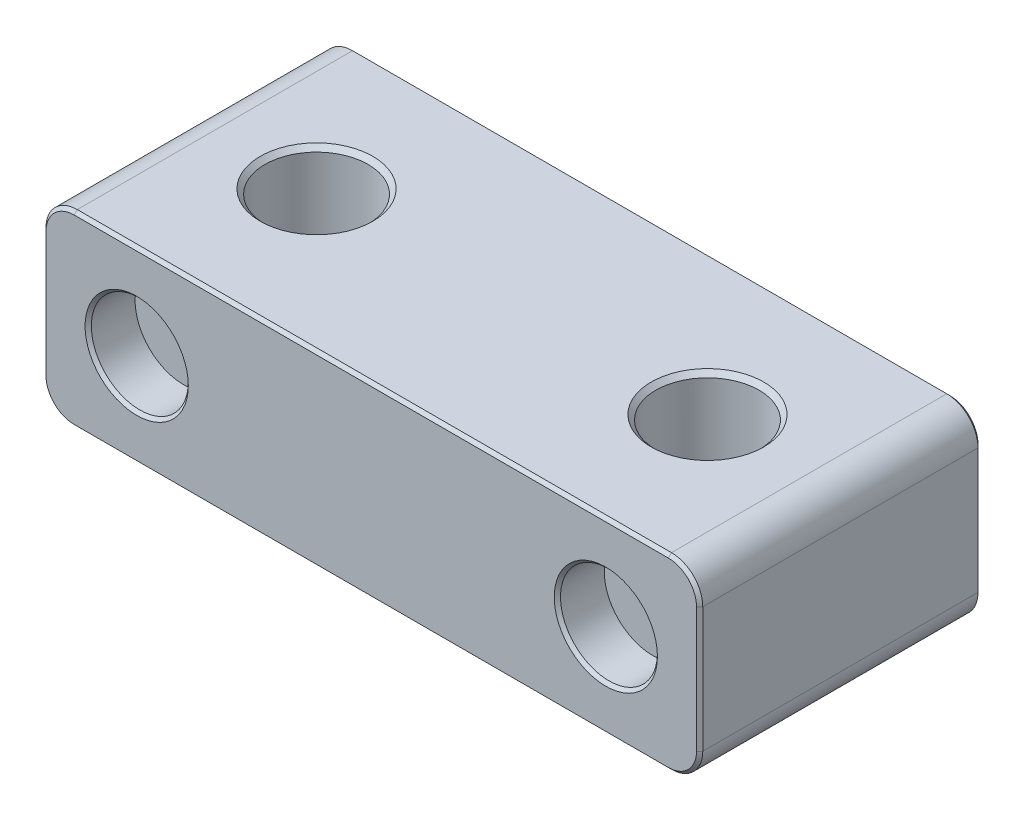
ISO-10303-21;
HEADER;
FILE_DESCRIPTION(('STEP AP214'),'2;1');
FILE_NAME('part.step','',(''),(''),'','','');
FILE_SCHEMA(('AUTOMOTIVE_DESIGN { 1 0 10303 214 1 1 1 1 }'));
ENDSEC;
DATA;
#1=APPLICATION_CONTEXT('core data for automotive mechanical design processes');
#2=APPLICATION_PROTOCOL_DEFINITION('international standard','automotive_design',2000,#1);
#3=PRODUCT_CONTEXT('',#1,'mechanical');
#4=PRODUCT('Part','Part','',(#3));
#5=PRODUCT_RELATED_PRODUCT_CATEGORY('part','',(#4));
#6=PRODUCT_DEFINITION_FORMATION('','',#4);
#7=PRODUCT_DEFINITION_CONTEXT('part definition',#1,'design');
#8=PRODUCT_DEFINITION('design','',#6,#7);
#9=PRODUCT_DEFINITION_SHAPE('','',#8);
#10=(LENGTH_UNIT() NAMED_UNIT(*) SI_UNIT(.MILLI.,.METRE.));
#11=(NAMED_UNIT(*) PLANE_ANGLE_UNIT() SI_UNIT($,.RADIAN.));
#12=(NAMED_UNIT(*) SI_UNIT($,.STERADIAN.) SOLID_ANGLE_UNIT());
#13=UNCERTAINTY_MEASURE_WITH_UNIT(LENGTH_MEASURE(1.E-05),#10,'distance_accuracy_value','');
#14=(GEOMETRIC_REPRESENTATION_CONTEXT(3) GLOBAL_UNCERTAINTY_ASSIGNED_CONTEXT((#13)) GLOBAL_UNIT_ASSIGNED_CONTEXT((#10,
#11,#12)) REPRESENTATION_CONTEXT('',''));
#15=CARTESIAN_POINT('',(0.,0.,0.));
#16=DIRECTION('',(0.,0.,1.));
#17=DIRECTION('',(1.,0.,0.));
#18=AXIS2_PLACEMENT_3D('',#15,#16,#17);
#19=CARTESIAN_POINT('',(0.,0.,9.));
#20=DIRECTION('',(0.,0.,1.));
#21=DIRECTION('',(1.,0.,0.));
#22=AXIS2_PLACEMENT_3D('',#19,#20,#21);
#23=PLANE('',#22);
#24=CARTESIAN_POINT('',(15.,0.,9.));
#25=DIRECTION('',(0.,0.,1.));
#26=DIRECTION('',(1.,0.,0.));
#27=AXIS2_PLACEMENT_3D('',#24,#25,#26);
#28=CIRCLE('',#27,3.3);
#29=CARTESIAN_POINT('',(18.3,0.,9.));
#30=VERTEX_POINT('',#29);
#31=EDGE_CURVE('E215',#30,#30,#28,.F.);
#32=ORIENTED_EDGE('',*,*,#31,.T.);
#33=EDGE_LOOP('',(#32));
#34=FACE_BOUND('',#33,.T.);
#35=DIRECTION('',(-1.,0.,0.));
#36=VECTOR('',#35,1.);
#37=CARTESIAN_POINT('',(-19.,5.8,9.));
#38=LINE('',#37,#36);
#39=CARTESIAN_POINT('',(19.,5.8,9.));
#40=VERTEX_POINT('',#39);
#41=CARTESIAN_POINT('',(-19.,5.8,9.));
#42=VERTEX_POINT('',#41);
#43=EDGE_CURVE('E33',#40,#42,#38,.T.);
#44=ORIENTED_EDGE('',*,*,#43,.T.);
#45=CARTESIAN_POINT('',(-19.,4.,9.));
#46=DIRECTION('',(0.,0.,1.));
#47=DIRECTION('',(1.,0.,0.));
#48=AXIS2_PLACEMENT_3D('',#45,#46,#47);
#49=CIRCLE('',#48,1.8);
#50=CARTESIAN_POINT('',(-20.8,4.,9.));
#51=VERTEX_POINT('',#50);
#52=EDGE_CURVE('E213',#42,#51,#49,.T.);
#53=ORIENTED_EDGE('',*,*,#52,.T.);
#54=DIRECTION('',(0.,-1.,0.));
#55=VECTOR('',#54,1.);
#56=CARTESIAN_POINT('',(-20.8,-4.,9.));
#57=LINE('',#56,#55);
#58=CARTESIAN_POINT('',(-20.8,-4.,9.));
#59=VERTEX_POINT('',#58);
#60=EDGE_CURVE('E201',#51,#59,#57,.T.);
#61=ORIENTED_EDGE('',*,*,#60,.T.);
#62=CARTESIAN_POINT('',(-19.,-4.,9.));
#63=DIRECTION('',(0.,0.,1.));
#64=DIRECTION('',(1.,0.,0.));
#65=AXIS2_PLACEMENT_3D('',#62,#63,#64);
#66=CIRCLE('',#65,1.8);
#67=CARTESIAN_POINT('',(-19.,-5.8,9.));
#68=VERTEX_POINT('',#67);
#69=EDGE_CURVE('E203',#59,#68,#66,.T.);
#70=ORIENTED_EDGE('',*,*,#69,.T.);
#71=DIRECTION('',(1.,0.,0.));
#72=VECTOR('',#71,1.);
#73=CARTESIAN_POINT('',(19.,-5.8,9.));
#74=LINE('',#73,#72);
#75=CARTESIAN_POINT('',(19.,-5.8,9.));
#76=VERTEX_POINT('',#75);
#77=EDGE_CURVE('E205',#68,#76,#74,.T.);
#78=ORIENTED_EDGE('',*,*,#77,.T.);
#79=CARTESIAN_POINT('',(19.,-4.,9.));
#80=DIRECTION('',(0.,0.,1.));
#81=DIRECTION('',(1.,0.,0.));
#82=AXIS2_PLACEMENT_3D('',#79,#80,#81);
#83=CIRCLE('',#82,1.8);
#84=CARTESIAN_POINT('',(20.8,-4.,9.));
#85=VERTEX_POINT('',#84);
#86=EDGE_CURVE('E207',#76,#85,#83,.T.);
#87=ORIENTED_EDGE('',*,*,#86,.T.);
#88=DIRECTION('',(0.,1.,0.));
#89=VECTOR('',#88,1.);
#90=CARTESIAN_POINT('',(20.8,4.,9.));
#91=LINE('',#90,#89);
#92=CARTESIAN_POINT('',(20.8,4.,9.));
#93=VERTEX_POINT('',#92);
#94=EDGE_CURVE('E209',#85,#93,#91,.T.);
#95=ORIENTED_EDGE('',*,*,#94,.T.);
#96=CARTESIAN_POINT('',(19.,4.,9.));
#97=DIRECTION('',(0.,0.,1.));
#98=DIRECTION('',(1.,0.,0.));
#99=AXIS2_PLACEMENT_3D('',#96,#97,#98);
#100=CIRCLE('',#99,1.8);
#101=EDGE_CURVE('E38',#93,#40,#100,.T.);
#102=ORIENTED_EDGE('',*,*,#101,.T.);
#103=EDGE_LOOP('',(#44,#53,#61,#70,#78,#87,#95,#102));
#104=FACE_BOUND('',#103,.T.);
#105=CARTESIAN_POINT('',(-15.,0.,9.));
#106=DIRECTION('',(0.,0.,1.));
#107=DIRECTION('',(1.,0.,0.));
#108=AXIS2_PLACEMENT_3D('',#105,#106,#107);
#109=CIRCLE('',#108,3.3);
#110=CARTESIAN_POINT('',(-11.7,0.,9.));
#111=VERTEX_POINT('',#110);
#112=EDGE_CURVE('E198',#111,#111,#109,.F.);
#113=ORIENTED_EDGE('',*,*,#112,.T.);
#114=EDGE_LOOP('',(#113));
#115=FACE_BOUND('',#114,.T.);
#116=ADVANCED_FACE('F17',(#34,#104,#115),#23,.T.);
#117=CARTESIAN_POINT('',(0.,0.,-9.));
#118=DIRECTION('',(0.,0.,1.));
#119=DIRECTION('',(1.,0.,0.));
#120=AXIS2_PLACEMENT_3D('',#117,#118,#119);
#121=PLANE('',#120);
#122=DIRECTION('',(0.,-1.,0.));
#123=VECTOR('',#122,1.);
#124=CARTESIAN_POINT('',(20.8,0.,-9.));
#125=LINE('',#124,#123);
#126=CARTESIAN_POINT('',(20.8,4.,-9.));
#127=VERTEX_POINT('',#126);
#128=CARTESIAN_POINT('',(20.8,-4.,-9.));
#129=VERTEX_POINT('',#128);
#130=EDGE_CURVE('E156',#127,#129,#125,.T.);
#131=ORIENTED_EDGE('',*,*,#130,.T.);
#132=CARTESIAN_POINT('',(19.,-4.,-9.));
#133=DIRECTION('',(0.,0.,1.));
#134=DIRECTION('',(1.,0.,0.));
#135=AXIS2_PLACEMENT_3D('',#132,#133,#134);
#136=CIRCLE('',#135,1.8);
#137=CARTESIAN_POINT('',(19.,-5.8,-9.));
#138=VERTEX_POINT('',#137);
#139=EDGE_CURVE('E136',#129,#138,#136,.F.);
#140=ORIENTED_EDGE('',*,*,#139,.T.);
#141=DIRECTION('',(-1.,0.,0.));
#142=VECTOR('',#141,1.);
#143=CARTESIAN_POINT('',(0.,-5.8,-9.));
#144=LINE('',#143,#142);
#145=CARTESIAN_POINT('',(-19.,-5.8,-9.));
#146=VERTEX_POINT('',#145);
#147=EDGE_CURVE('E145',#138,#146,#144,.T.);
#148=ORIENTED_EDGE('',*,*,#147,.T.);
#149=CARTESIAN_POINT('',(-19.,-4.,-9.));
#150=DIRECTION('',(0.,0.,1.));
#151=DIRECTION('',(1.,0.,0.));
#152=AXIS2_PLACEMENT_3D('',#149,#150,#151);
#153=CIRCLE('',#152,1.8);
#154=CARTESIAN_POINT('',(-20.8,-4.,-9.));
#155=VERTEX_POINT('',#154);
#156=EDGE_CURVE('E151',#146,#155,#153,.F.);
#157=ORIENTED_EDGE('',*,*,#156,.T.);
#158=DIRECTION('',(0.,1.,0.));
#159=VECTOR('',#158,1.);
#160=CARTESIAN_POINT('',(-20.8,0.,-9.));
#161=LINE('',#160,#159);
#162=CARTESIAN_POINT('',(-20.8,4.,-9.));
#163=VERTEX_POINT('',#162);
#164=EDGE_CURVE('E335',#155,#163,#161,.T.);
#165=ORIENTED_EDGE('',*,*,#164,.T.);
#166=CARTESIAN_POINT('',(-19.,4.,-9.));
#167=DIRECTION('',(0.,0.,1.));
#168=DIRECTION('',(1.,0.,0.));
#169=AXIS2_PLACEMENT_3D('',#166,#167,#168);
#170=CIRCLE('',#169,1.8);
#171=CARTESIAN_POINT('',(-19.,5.8,-9.));
#172=VERTEX_POINT('',#171);
#173=EDGE_CURVE('E331',#163,#172,#170,.F.);
#174=ORIENTED_EDGE('',*,*,#173,.T.);
#175=DIRECTION('',(1.,0.,0.));
#176=VECTOR('',#175,1.);
#177=CARTESIAN_POINT('',(0.,5.8,-9.));
#178=LINE('',#177,#176);
#179=CARTESIAN_POINT('',(19.,5.8,-9.));
#180=VERTEX_POINT('',#179);
#181=EDGE_CURVE('E330',#172,#180,#178,.T.);
#182=ORIENTED_EDGE('',*,*,#181,.T.);
#183=CARTESIAN_POINT('',(19.,4.,-9.));
#184=DIRECTION('',(0.,0.,1.));
#185=DIRECTION('',(1.,0.,0.));
#186=AXIS2_PLACEMENT_3D('',#183,#184,#185);
#187=CIRCLE('',#186,1.8);
#188=EDGE_CURVE('E161',#180,#127,#187,.F.);
#189=ORIENTED_EDGE('',*,*,#188,.T.);
#190=EDGE_LOOP('',(#131,#140,#148,#157,#165,#174,#182,#189));
#191=FACE_BOUND('',#190,.T.);
#192=ADVANCED_FACE('F154',(#191),#121,.F.);
#193=CARTESIAN_POINT('',(-21.,6.,9.));
#194=DIRECTION('',(1.,0.,0.));
#195=DIRECTION('',(0.,0.,-1.));
#196=AXIS2_PLACEMENT_3D('',#193,#194,#195);
#197=PLANE('',#196);
#198=DIRECTION('',(0.,0.,-1.));
#199=VECTOR('',#198,1.);
#200=CARTESIAN_POINT('',(-21.,4.,9.));
#201=LINE('',#200,#199);
#202=CARTESIAN_POINT('',(-21.,4.,8.8));
#203=VERTEX_POINT('',#202);
#204=CARTESIAN_POINT('',(-21.,4.,-8.8));
#205=VERTEX_POINT('',#204);
#206=EDGE_CURVE('E348',#203,#205,#201,.T.);
#207=ORIENTED_EDGE('',*,*,#206,.T.);
#208=DIRECTION('',(0.,-1.,0.));
#209=VECTOR('',#208,1.);
#210=CARTESIAN_POINT('',(-21.,6.,-8.8));
#211=LINE('',#210,#209);
#212=CARTESIAN_POINT('',(-21.,-4.,-8.8));
#213=VERTEX_POINT('',#212);
#214=EDGE_CURVE('E185',#205,#213,#211,.T.);
#215=ORIENTED_EDGE('',*,*,#214,.T.);
#216=DIRECTION('',(0.,0.,-1.));
#217=VECTOR('',#216,1.);
#218=CARTESIAN_POINT('',(-21.,-4.,9.));
#219=LINE('',#218,#217);
#220=CARTESIAN_POINT('',(-21.,-4.,8.8));
#221=VERTEX_POINT('',#220);
#222=EDGE_CURVE('E345',#213,#221,#219,.F.);
#223=ORIENTED_EDGE('',*,*,#222,.T.);
#224=DIRECTION('',(0.,1.,0.));
#225=VECTOR('',#224,1.);
#226=CARTESIAN_POINT('',(-21.,4.,8.8));
#227=LINE('',#226,#225);
#228=EDGE_CURVE('E183',#221,#203,#227,.T.);
#229=ORIENTED_EDGE('',*,*,#228,.T.);
#230=EDGE_LOOP('',(#207,#215,#223,#229));
#231=FACE_BOUND('',#230,.T.);
#232=ADVANCED_FACE('F394',(#231),#197,.F.);
#233=CARTESIAN_POINT('',(-21.,-6.,9.));
#234=DIRECTION('',(0.,1.,0.));
#235=DIRECTION('',(0.,0.,1.));
#236=AXIS2_PLACEMENT_3D('',#233,#234,#235);
#237=PLANE('',#236);
#238=CARTESIAN_POINT('',(12.5,-6.,0.));
#239=DIRECTION('',(0.,1.,0.));
#240=DIRECTION('',(0.,0.,1.));
#241=AXIS2_PLACEMENT_3D('',#238,#239,#240);
#242=CIRCLE('',#241,1.95);
#243=CARTESIAN_POINT('',(12.5,-6.,1.95));
#244=VERTEX_POINT('',#243);
#245=EDGE_CURVE('E264',#244,#244,#242,.T.);
#246=ORIENTED_EDGE('',*,*,#245,.T.);
#247=EDGE_LOOP('',(#246));
#248=FACE_BOUND('',#247,.T.);
#249=CARTESIAN_POINT('',(-12.5,-6.,0.));
#250=DIRECTION('',(0.,1.,0.));
#251=DIRECTION('',(0.,0.,1.));
#252=AXIS2_PLACEMENT_3D('',#249,#250,#251);
#253=CIRCLE('',#252,1.95);
#254=CARTESIAN_POINT('',(-12.5,-6.,1.95));
#255=VERTEX_POINT('',#254);
#256=EDGE_CURVE('E220',#255,#255,#253,.T.);
#257=ORIENTED_EDGE('',*,*,#256,.T.);
#258=EDGE_LOOP('',(#257));
#259=FACE_BOUND('',#258,.T.);
#260=DIRECTION('',(0.,0.,-1.));
#261=VECTOR('',#260,1.);
#262=CARTESIAN_POINT('',(-19.,-6.,9.));
#263=LINE('',#262,#261);
#264=CARTESIAN_POINT('',(-19.,-6.,8.8));
#265=VERTEX_POINT('',#264);
#266=CARTESIAN_POINT('',(-19.,-6.,-8.8));
#267=VERTEX_POINT('',#266);
#268=EDGE_CURVE('E351',#265,#267,#263,.T.);
#269=ORIENTED_EDGE('',*,*,#268,.T.);
#270=DIRECTION('',(1.,0.,0.));
#271=VECTOR('',#270,1.);
#272=CARTESIAN_POINT('',(-21.,-6.,-8.8));
#273=LINE('',#272,#271);
#274=CARTESIAN_POINT('',(19.,-6.,-8.8));
#275=VERTEX_POINT('',#274);
#276=EDGE_CURVE('E193',#267,#275,#273,.T.);
#277=ORIENTED_EDGE('',*,*,#276,.T.);
#278=DIRECTION('',(0.,0.,-1.));
#279=VECTOR('',#278,1.);
#280=CARTESIAN_POINT('',(19.,-6.,9.));
#281=LINE('',#280,#279);
#282=CARTESIAN_POINT('',(19.,-6.,8.8));
#283=VERTEX_POINT('',#282);
#284=EDGE_CURVE('E354',#275,#283,#281,.F.);
#285=ORIENTED_EDGE('',*,*,#284,.T.);
#286=DIRECTION('',(-1.,0.,0.));
#287=VECTOR('',#286,1.);
#288=CARTESIAN_POINT('',(-19.,-6.,8.8));
#289=LINE('',#288,#287);
#290=EDGE_CURVE('E191',#283,#265,#289,.T.);
#291=ORIENTED_EDGE('',*,*,#290,.T.);
#292=EDGE_LOOP('',(#269,#277,#285,#291));
#293=FACE_BOUND('',#292,.T.);
#294=ADVANCED_FACE('F401',(#248,#259,#293),#237,.F.);
#295=CARTESIAN_POINT('',(21.,6.,9.));
#296=DIRECTION('',(-1.,0.,0.));
#297=DIRECTION('',(0.,-1.,0.));
#298=AXIS2_PLACEMENT_3D('',#295,#296,#297);
#299=PLANE('',#298);
#300=DIRECTION('',(0.,0.,-1.));
#301=VECTOR('',#300,1.);
#302=CARTESIAN_POINT('',(21.,-4.,9.));
#303=LINE('',#302,#301);
#304=CARTESIAN_POINT('',(21.,-4.,8.8));
#305=VERTEX_POINT('',#304);
#306=CARTESIAN_POINT('',(21.,-4.,-8.8));
#307=VERTEX_POINT('',#306);
#308=EDGE_CURVE('E339',#305,#307,#303,.T.);
#309=ORIENTED_EDGE('',*,*,#308,.T.);
#310=DIRECTION('',(0.,1.,0.));
#311=VECTOR('',#310,1.);
#312=CARTESIAN_POINT('',(21.,6.,-8.8));
#313=LINE('',#312,#311);
#314=CARTESIAN_POINT('',(21.,4.,-8.8));
#315=VERTEX_POINT('',#314);
#316=EDGE_CURVE('E168',#307,#315,#313,.T.);
#317=ORIENTED_EDGE('',*,*,#316,.T.);
#318=DIRECTION('',(0.,0.,-1.));
#319=VECTOR('',#318,1.);
#320=CARTESIAN_POINT('',(21.,4.,9.));
#321=LINE('',#320,#319);
#322=CARTESIAN_POINT('',(21.,4.,8.8));
#323=VERTEX_POINT('',#322);
#324=EDGE_CURVE('E342',#315,#323,#321,.F.);
#325=ORIENTED_EDGE('',*,*,#324,.T.);
#326=DIRECTION('',(0.,-1.,0.));
#327=VECTOR('',#326,1.);
#328=CARTESIAN_POINT('',(21.,-4.,8.8));
#329=LINE('',#328,#327);
#330=EDGE_CURVE('E166',#323,#305,#329,.T.);
#331=ORIENTED_EDGE('',*,*,#330,.T.);
#332=EDGE_LOOP('',(#309,#317,#325,#331));
#333=FACE_BOUND('',#332,.T.);
#334=ADVANCED_FACE('F306',(#333),#299,.F.);
#335=CARTESIAN_POINT('',(-21.,6.,9.));
#336=DIRECTION('',(0.,-1.,0.));
#337=DIRECTION('',(1.,0.,0.));
#338=AXIS2_PLACEMENT_3D('',#335,#336,#337);
#339=PLANE('',#338);
#340=CARTESIAN_POINT('',(12.5,6.,0.));
#341=DIRECTION('',(0.,-1.,0.));
#342=DIRECTION('',(1.,0.,0.));
#343=AXIS2_PLACEMENT_3D('',#340,#341,#342);
#344=CIRCLE('',#343,3.6);
#345=CARTESIAN_POINT('',(16.1,6.,0.));
#346=VERTEX_POINT('',#345);
#347=EDGE_CURVE('E288',#346,#346,#344,.T.);
#348=ORIENTED_EDGE('',*,*,#347,.T.);
#349=EDGE_LOOP('',(#348));
#350=FACE_BOUND('',#349,.T.);
#351=CARTESIAN_POINT('',(-12.5,6.,0.));
#352=DIRECTION('',(0.,-1.,0.));
#353=DIRECTION('',(1.,0.,0.));
#354=AXIS2_PLACEMENT_3D('',#351,#352,#353);
#355=CIRCLE('',#354,3.6);
#356=CARTESIAN_POINT('',(-8.9,6.,0.));
#357=VERTEX_POINT('',#356);
#358=EDGE_CURVE('E285',#357,#357,#355,.T.);
#359=ORIENTED_EDGE('',*,*,#358,.T.);
#360=EDGE_LOOP('',(#359));
#361=FACE_BOUND('',#360,.T.);
#362=DIRECTION('',(0.,0.,-1.));
#363=VECTOR('',#362,1.);
#364=CARTESIAN_POINT('',(19.,6.,9.));
#365=LINE('',#364,#363);
#366=CARTESIAN_POINT('',(19.,6.,8.8));
#367=VERTEX_POINT('',#366);
#368=CARTESIAN_POINT('',(19.,6.,-8.8));
#369=VERTEX_POINT('',#368);
#370=EDGE_CURVE('E152',#367,#369,#365,.T.);
#371=ORIENTED_EDGE('',*,*,#370,.T.);
#372=DIRECTION('',(-1.,0.,0.));
#373=VECTOR('',#372,1.);
#374=CARTESIAN_POINT('',(-21.,6.,-8.8));
#375=LINE('',#374,#373);
#376=CARTESIAN_POINT('',(-19.,6.,-8.8));
#377=VERTEX_POINT('',#376);
#378=EDGE_CURVE('E176',#369,#377,#375,.T.);
#379=ORIENTED_EDGE('',*,*,#378,.T.);
#380=DIRECTION('',(0.,0.,-1.));
#381=VECTOR('',#380,1.);
#382=CARTESIAN_POINT('',(-19.,6.,9.));
#383=LINE('',#382,#381);
#384=CARTESIAN_POINT('',(-19.,6.,8.8));
#385=VERTEX_POINT('',#384);
#386=EDGE_CURVE('E318',#377,#385,#383,.F.);
#387=ORIENTED_EDGE('',*,*,#386,.T.);
#388=DIRECTION('',(1.,0.,0.));
#389=VECTOR('',#388,1.);
#390=CARTESIAN_POINT('',(19.,6.,8.8));
#391=LINE('',#390,#389);
#392=EDGE_CURVE('E174',#385,#367,#391,.T.);
#393=ORIENTED_EDGE('',*,*,#392,.T.);
#394=EDGE_LOOP('',(#371,#379,#387,#393));
#395=FACE_BOUND('',#394,.T.);
#396=ADVANCED_FACE('F302',(#350,#361,#395),#339,.F.);
#397=CARTESIAN_POINT('',(-15.,0.,9.));
#398=DIRECTION('',(0.,0.,-1.));
#399=DIRECTION('',(-1.,0.,0.));
#400=AXIS2_PLACEMENT_3D('',#397,#398,#399);
#401=CYLINDRICAL_SURFACE('',#400,3.1);
#402=CARTESIAN_POINT('',(-15.,0.,8.8));
#403=DIRECTION('',(0.,0.,1.));
#404=DIRECTION('',(1.,0.,0.));
#405=AXIS2_PLACEMENT_3D('',#402,#403,#404);
#406=CIRCLE('',#405,3.1);
#407=CARTESIAN_POINT('',(-11.9,0.,8.8));
#408=VERTEX_POINT('',#407);
#409=EDGE_CURVE('E218',#408,#408,#406,.T.);
#410=ORIENTED_EDGE('',*,*,#409,.T.);
#411=EDGE_LOOP('',(#410));
#412=FACE_BOUND('',#411,.T.);
#413=CARTESIAN_POINT('',(-15.,0.,6.));
#414=DIRECTION('',(0.,0.,1.));
#415=DIRECTION('',(1.,0.,0.));
#416=AXIS2_PLACEMENT_3D('',#413,#414,#415);
#417=CIRCLE('',#416,3.1);
#418=CARTESIAN_POINT('',(-11.9,0.,6.));
#419=VERTEX_POINT('',#418);
#420=EDGE_CURVE('E357',#419,#419,#417,.T.);
#421=ORIENTED_EDGE('',*,*,#420,.F.);
#422=EDGE_LOOP('',(#421));
#423=FACE_BOUND('',#422,.T.);
#424=ADVANCED_FACE('F305',(#412,#423),#401,.F.);
#425=CARTESIAN_POINT('',(15.,0.,9.));
#426=DIRECTION('',(0.,0.,-1.));
#427=DIRECTION('',(-1.,0.,0.));
#428=AXIS2_PLACEMENT_3D('',#425,#426,#427);
#429=CYLINDRICAL_SURFACE('',#428,3.1);
#430=CARTESIAN_POINT('',(15.,0.,8.8));
#431=DIRECTION('',(0.,0.,1.));
#432=DIRECTION('',(1.,0.,0.));
#433=AXIS2_PLACEMENT_3D('',#430,#431,#432);
#434=CIRCLE('',#433,3.1);
#435=CARTESIAN_POINT('',(18.1,0.,8.8));
#436=VERTEX_POINT('',#435);
#437=EDGE_CURVE('E195',#436,#436,#434,.T.);
#438=ORIENTED_EDGE('',*,*,#437,.T.);
#439=EDGE_LOOP('',(#438));
#440=FACE_BOUND('',#439,.T.);
#441=CARTESIAN_POINT('',(15.,0.,6.));
#442=DIRECTION('',(0.,0.,1.));
#443=DIRECTION('',(1.,0.,0.));
#444=AXIS2_PLACEMENT_3D('',#441,#442,#443);
#445=CIRCLE('',#444,3.1);
#446=CARTESIAN_POINT('',(18.1,0.,6.));
#447=VERTEX_POINT('',#446);
#448=EDGE_CURVE('E239',#447,#447,#445,.T.);
#449=ORIENTED_EDGE('',*,*,#448,.F.);
#450=EDGE_LOOP('',(#449));
#451=FACE_BOUND('',#450,.T.);
#452=ADVANCED_FACE('F649',(#440,#451),#429,.F.);
#453=CARTESIAN_POINT('',(15.,0.,6.));
#454=DIRECTION('',(0.,0.,1.));
#455=DIRECTION('',(1.,0.,0.));
#456=AXIS2_PLACEMENT_3D('',#453,#454,#455);
#457=PLANE('',#456);
#458=ORIENTED_EDGE('',*,*,#448,.T.);
#459=EDGE_LOOP('',(#458));
#460=FACE_BOUND('',#459,.T.);
#461=ADVANCED_FACE('F640',(#460),#457,.T.);
#462=CARTESIAN_POINT('',(-15.,0.,6.));
#463=DIRECTION('',(0.,0.,1.));
#464=DIRECTION('',(1.,0.,0.));
#465=AXIS2_PLACEMENT_3D('',#462,#463,#464);
#466=PLANE('',#465);
#467=ORIENTED_EDGE('',*,*,#420,.T.);
#468=EDGE_LOOP('',(#467));
#469=FACE_BOUND('',#468,.T.);
#470=ADVANCED_FACE('F413',(#469),#466,.T.);
#471=CARTESIAN_POINT('',(-19.,-4.,9.));
#472=DIRECTION('',(0.,0.,-1.));
#473=DIRECTION('',(-1.,0.,0.));
#474=AXIS2_PLACEMENT_3D('',#471,#472,#473);
#475=CYLINDRICAL_SURFACE('',#474,2.);
#476=ORIENTED_EDGE('',*,*,#222,.F.);
#477=CARTESIAN_POINT('',(-19.,-4.,-8.8));
#478=DIRECTION('',(0.,0.,1.));
#479=DIRECTION('',(1.,0.,0.));
#480=AXIS2_PLACEMENT_3D('',#477,#478,#479);
#481=CIRCLE('',#480,2.);
#482=EDGE_CURVE('E189',#213,#267,#481,.T.);
#483=ORIENTED_EDGE('',*,*,#482,.T.);
#484=ORIENTED_EDGE('',*,*,#268,.F.);
#485=CARTESIAN_POINT('',(-19.,-4.,8.8));
#486=DIRECTION('',(0.,0.,1.));
#487=DIRECTION('',(1.,0.,0.));
#488=AXIS2_PLACEMENT_3D('',#485,#486,#487);
#489=CIRCLE('',#488,2.);
#490=EDGE_CURVE('E187',#265,#221,#489,.F.);
#491=ORIENTED_EDGE('',*,*,#490,.T.);
#492=EDGE_LOOP('',(#476,#483,#484,#491));
#493=FACE_BOUND('',#492,.T.);
#494=ADVANCED_FACE('F409',(#493),#475,.T.);
#495=CARTESIAN_POINT('',(19.,-4.,9.));
#496=DIRECTION('',(0.,0.,-1.));
#497=DIRECTION('',(-1.,0.,0.));
#498=AXIS2_PLACEMENT_3D('',#495,#496,#497);
#499=CYLINDRICAL_SURFACE('',#498,2.);
#500=ORIENTED_EDGE('',*,*,#284,.F.);
#501=CARTESIAN_POINT('',(19.,-4.,-8.8));
#502=DIRECTION('',(0.,0.,1.));
#503=DIRECTION('',(1.,0.,0.));
#504=AXIS2_PLACEMENT_3D('',#501,#502,#503);
#505=CIRCLE('',#504,2.);
#506=EDGE_CURVE('E138',#275,#307,#505,.T.);
#507=ORIENTED_EDGE('',*,*,#506,.T.);
#508=ORIENTED_EDGE('',*,*,#308,.F.);
#509=CARTESIAN_POINT('',(19.,-4.,8.8));
#510=DIRECTION('',(0.,0.,1.));
#511=DIRECTION('',(1.,0.,0.));
#512=AXIS2_PLACEMENT_3D('',#509,#510,#511);
#513=CIRCLE('',#512,2.);
#514=EDGE_CURVE('E158',#305,#283,#513,.F.);
#515=ORIENTED_EDGE('',*,*,#514,.T.);
#516=EDGE_LOOP('',(#500,#507,#508,#515));
#517=FACE_BOUND('',#516,.T.);
#518=ADVANCED_FACE('F412',(#517),#499,.T.);
#519=CARTESIAN_POINT('',(19.,4.,9.));
#520=DIRECTION('',(0.,0.,-1.));
#521=DIRECTION('',(-1.,0.,0.));
#522=AXIS2_PLACEMENT_3D('',#519,#520,#521);
#523=CYLINDRICAL_SURFACE('',#522,2.);
#524=ORIENTED_EDGE('',*,*,#324,.F.);
#525=CARTESIAN_POINT('',(19.,4.,-8.8));
#526=DIRECTION('',(0.,0.,1.));
#527=DIRECTION('',(1.,0.,0.));
#528=AXIS2_PLACEMENT_3D('',#525,#526,#527);
#529=CIRCLE('',#528,2.);
#530=EDGE_CURVE('E172',#315,#369,#529,.T.);
#531=ORIENTED_EDGE('',*,*,#530,.T.);
#532=ORIENTED_EDGE('',*,*,#370,.F.);
#533=CARTESIAN_POINT('',(19.,4.,8.8));
#534=DIRECTION('',(0.,0.,1.));
#535=DIRECTION('',(1.,0.,0.));
#536=AXIS2_PLACEMENT_3D('',#533,#534,#535);
#537=CIRCLE('',#536,2.);
#538=EDGE_CURVE('E170',#367,#323,#537,.F.);
#539=ORIENTED_EDGE('',*,*,#538,.T.);
#540=EDGE_LOOP('',(#524,#531,#532,#539));
#541=FACE_BOUND('',#540,.T.);
#542=ADVANCED_FACE('F417',(#541),#523,.T.);
#543=CARTESIAN_POINT('',(-19.,4.,9.));
#544=DIRECTION('',(0.,0.,-1.));
#545=DIRECTION('',(-1.,0.,0.));
#546=AXIS2_PLACEMENT_3D('',#543,#544,#545);
#547=CYLINDRICAL_SURFACE('',#546,2.);
#548=ORIENTED_EDGE('',*,*,#386,.F.);
#549=CARTESIAN_POINT('',(-19.,4.,-8.8));
#550=DIRECTION('',(0.,0.,1.));
#551=DIRECTION('',(1.,0.,0.));
#552=AXIS2_PLACEMENT_3D('',#549,#550,#551);
#553=CIRCLE('',#552,2.);
#554=EDGE_CURVE('E181',#377,#205,#553,.T.);
#555=ORIENTED_EDGE('',*,*,#554,.T.);
#556=ORIENTED_EDGE('',*,*,#206,.F.);
#557=CARTESIAN_POINT('',(-19.,4.,8.8));
#558=DIRECTION('',(0.,0.,1.));
#559=DIRECTION('',(1.,0.,0.));
#560=AXIS2_PLACEMENT_3D('',#557,#558,#559);
#561=CIRCLE('',#560,2.);
#562=EDGE_CURVE('E178',#203,#385,#561,.F.);
#563=ORIENTED_EDGE('',*,*,#562,.T.);
#564=EDGE_LOOP('',(#548,#555,#556,#563));
#565=FACE_BOUND('',#564,.T.);
#566=ADVANCED_FACE('F421',(#565),#547,.T.);
#567=CARTESIAN_POINT('',(-19.,4.,-9.));
#568=DIRECTION('',(0.,0.,1.));
#569=DIRECTION('',(1.,0.,0.));
#570=AXIS2_PLACEMENT_3D('',#567,#568,#569);
#571=CONICAL_SURFACE('',#570,1.8,0.785398163397448);
#572=DIRECTION('',(0.707106781186548,0.,-0.707106781186548));
#573=VECTOR('',#572,1.);
#574=CARTESIAN_POINT('',(-21.,4.,-8.8));
#575=LINE('',#574,#573);
#576=EDGE_CURVE('E233',#205,#163,#575,.T.);
#577=ORIENTED_EDGE('',*,*,#576,.F.);
#578=ORIENTED_EDGE('',*,*,#554,.F.);
#579=DIRECTION('',(0.,0.707106781186548,0.707106781186548));
#580=VECTOR('',#579,1.);
#581=CARTESIAN_POINT('',(-19.,5.8,-9.));
#582=LINE('',#581,#580);
#583=EDGE_CURVE('E236',#172,#377,#582,.T.);
#584=ORIENTED_EDGE('',*,*,#583,.F.);
#585=ORIENTED_EDGE('',*,*,#173,.F.);
#586=EDGE_LOOP('',(#577,#578,#584,#585));
#587=FACE_BOUND('',#586,.T.);
#588=ADVANCED_FACE('F424',(#587),#571,.T.);
#589=CARTESIAN_POINT('',(-21.,6.,-8.8));
#590=DIRECTION('',(0.,-0.707106781186548,0.707106781186547));
#591=DIRECTION('',(-1.,0.,0.));
#592=AXIS2_PLACEMENT_3D('',#589,#590,#591);
#593=PLANE('',#592);
#594=ORIENTED_EDGE('',*,*,#583,.T.);
#595=ORIENTED_EDGE('',*,*,#378,.F.);
#596=DIRECTION('',(0.,0.707106781186546,0.707106781186549));
#597=VECTOR('',#596,1.);
#598=CARTESIAN_POINT('',(19.,5.8,-9.));
#599=LINE('',#598,#597);
#600=EDGE_CURVE('E230',#180,#369,#599,.T.);
#601=ORIENTED_EDGE('',*,*,#600,.F.);
#602=ORIENTED_EDGE('',*,*,#181,.F.);
#603=EDGE_LOOP('',(#594,#595,#601,#602));
#604=FACE_BOUND('',#603,.T.);
#605=ADVANCED_FACE('F322',(#604),#593,.F.);
#606=CARTESIAN_POINT('',(-21.,6.,-8.8));
#607=DIRECTION('',(0.707106781186548,0.,0.707106781186548));
#608=DIRECTION('',(0.,-1.,0.));
#609=AXIS2_PLACEMENT_3D('',#606,#607,#608);
#610=PLANE('',#609);
#611=ORIENTED_EDGE('',*,*,#576,.T.);
#612=ORIENTED_EDGE('',*,*,#164,.F.);
#613=DIRECTION('',(0.707106781186548,0.,-0.707106781186548));
#614=VECTOR('',#613,1.);
#615=CARTESIAN_POINT('',(-21.,-4.,-8.8));
#616=LINE('',#615,#614);
#617=EDGE_CURVE('E227',#213,#155,#616,.T.);
#618=ORIENTED_EDGE('',*,*,#617,.F.);
#619=ORIENTED_EDGE('',*,*,#214,.F.);
#620=EDGE_LOOP('',(#611,#612,#618,#619));
#621=FACE_BOUND('',#620,.T.);
#622=ADVANCED_FACE('F459',(#621),#610,.F.);
#623=CARTESIAN_POINT('',(19.,4.,-9.));
#624=DIRECTION('',(0.,0.,1.));
#625=DIRECTION('',(1.,0.,0.));
#626=AXIS2_PLACEMENT_3D('',#623,#624,#625);
#627=CONICAL_SURFACE('',#626,1.8,0.785398163397444);
#628=ORIENTED_EDGE('',*,*,#600,.T.);
#629=ORIENTED_EDGE('',*,*,#530,.F.);
#630=DIRECTION('',(0.707106781186548,0.,0.707106781186548));
#631=VECTOR('',#630,1.);
#632=CARTESIAN_POINT('',(20.8,4.,-9.));
#633=LINE('',#632,#631);
#634=EDGE_CURVE('E224',#127,#315,#633,.T.);
#635=ORIENTED_EDGE('',*,*,#634,.F.);
#636=ORIENTED_EDGE('',*,*,#188,.F.);
#637=EDGE_LOOP('',(#628,#629,#635,#636));
#638=FACE_BOUND('',#637,.T.);
#639=ADVANCED_FACE('F328',(#638),#627,.T.);
#640=CARTESIAN_POINT('',(-19.,-4.,-9.));
#641=DIRECTION('',(0.,0.,1.));
#642=DIRECTION('',(1.,0.,0.));
#643=AXIS2_PLACEMENT_3D('',#640,#641,#642);
#644=CONICAL_SURFACE('',#643,1.8,0.785398163397444);
#645=ORIENTED_EDGE('',*,*,#617,.T.);
#646=ORIENTED_EDGE('',*,*,#156,.F.);
#647=DIRECTION('',(0.,0.707106781186545,-0.707106781186551));
#648=VECTOR('',#647,1.);
#649=CARTESIAN_POINT('',(-19.,-6.,-8.8));
#650=LINE('',#649,#648);
#651=EDGE_CURVE('E148',#267,#146,#650,.T.);
#652=ORIENTED_EDGE('',*,*,#651,.F.);
#653=ORIENTED_EDGE('',*,*,#482,.F.);
#654=EDGE_LOOP('',(#645,#646,#652,#653));
#655=FACE_BOUND('',#654,.T.);
#656=ADVANCED_FACE('F446',(#655),#644,.T.);
#657=CARTESIAN_POINT('',(21.,6.,-8.8));
#658=DIRECTION('',(-0.707106781186545,0.,0.707106781186551));
#659=DIRECTION('',(0.,1.,0.));
#660=AXIS2_PLACEMENT_3D('',#657,#658,#659);
#661=PLANE('',#660);
#662=ORIENTED_EDGE('',*,*,#634,.T.);
#663=ORIENTED_EDGE('',*,*,#316,.F.);
#664=DIRECTION('',(0.707106781186554,0.,0.707106781186541));
#665=VECTOR('',#664,1.);
#666=CARTESIAN_POINT('',(20.8,-4.,-9.));
#667=LINE('',#666,#665);
#668=EDGE_CURVE('E141',#129,#307,#667,.T.);
#669=ORIENTED_EDGE('',*,*,#668,.F.);
#670=ORIENTED_EDGE('',*,*,#130,.F.);
#671=EDGE_LOOP('',(#662,#663,#669,#670));
#672=FACE_BOUND('',#671,.T.);
#673=ADVANCED_FACE('F440',(#672),#661,.F.);
#674=CARTESIAN_POINT('',(-21.,-6.,-8.8));
#675=DIRECTION('',(0.,0.707106781186548,0.707106781186548));
#676=DIRECTION('',(1.,0.,0.));
#677=AXIS2_PLACEMENT_3D('',#674,#675,#676);
#678=PLANE('',#677);
#679=ORIENTED_EDGE('',*,*,#651,.T.);
#680=ORIENTED_EDGE('',*,*,#147,.F.);
#681=DIRECTION('',(0.,0.707106781186548,-0.707106781186548));
#682=VECTOR('',#681,1.);
#683=CARTESIAN_POINT('',(19.,-6.,-8.8));
#684=LINE('',#683,#682);
#685=EDGE_CURVE('E132',#275,#138,#684,.T.);
#686=ORIENTED_EDGE('',*,*,#685,.F.);
#687=ORIENTED_EDGE('',*,*,#276,.F.);
#688=EDGE_LOOP('',(#679,#680,#686,#687));
#689=FACE_BOUND('',#688,.T.);
#690=ADVANCED_FACE('F146',(#689),#678,.F.);
#691=CARTESIAN_POINT('',(19.,-4.,-9.));
#692=DIRECTION('',(0.,0.,1.));
#693=DIRECTION('',(1.,0.,0.));
#694=AXIS2_PLACEMENT_3D('',#691,#692,#693);
#695=CONICAL_SURFACE('',#694,1.8,0.785398163397448);
#696=ORIENTED_EDGE('',*,*,#668,.T.);
#697=ORIENTED_EDGE('',*,*,#506,.F.);
#698=ORIENTED_EDGE('',*,*,#685,.T.);
#699=ORIENTED_EDGE('',*,*,#139,.F.);
#700=EDGE_LOOP('',(#696,#697,#698,#699));
#701=FACE_BOUND('',#700,.T.);
#702=ADVANCED_FACE('F134',(#701),#695,.T.);
#703=CARTESIAN_POINT('',(15.,0.,8.8));
#704=DIRECTION('',(0.,0.,1.));
#705=DIRECTION('',(1.,0.,0.));
#706=AXIS2_PLACEMENT_3D('',#703,#704,#705);
#707=CONICAL_SURFACE('',#706,3.1,0.785398163397438);
#708=ORIENTED_EDGE('',*,*,#31,.F.);
#709=EDGE_LOOP('',(#708));
#710=FACE_BOUND('',#709,.T.);
#711=ORIENTED_EDGE('',*,*,#437,.F.);
#712=EDGE_LOOP('',(#711));
#713=FACE_BOUND('',#712,.T.);
#714=ADVANCED_FACE('F434',(#710,#713),#707,.F.);
#715=CARTESIAN_POINT('',(19.,-4.,9.));
#716=DIRECTION('',(0.,0.,-1.));
#717=DIRECTION('',(-1.,0.,0.));
#718=AXIS2_PLACEMENT_3D('',#715,#716,#717);
#719=CONICAL_SURFACE('',#718,1.8,0.785398163397448);
#720=DIRECTION('',(0.,0.707106781186545,0.707106781186551));
#721=VECTOR('',#720,1.);
#722=CARTESIAN_POINT('',(19.,-6.,8.8));
#723=LINE('',#722,#721);
#724=EDGE_CURVE('E257',#283,#76,#723,.T.);
#725=ORIENTED_EDGE('',*,*,#724,.F.);
#726=ORIENTED_EDGE('',*,*,#514,.F.);
#727=DIRECTION('',(0.707106781186548,0.,-0.707106781186548));
#728=VECTOR('',#727,1.);
#729=CARTESIAN_POINT('',(20.8,-4.,9.));
#730=LINE('',#729,#728);
#731=EDGE_CURVE('E142',#85,#305,#730,.T.);
#732=ORIENTED_EDGE('',*,*,#731,.F.);
#733=ORIENTED_EDGE('',*,*,#86,.F.);
#734=EDGE_LOOP('',(#725,#726,#732,#733));
#735=FACE_BOUND('',#734,.T.);
#736=ADVANCED_FACE('F481',(#735),#719,.T.);
#737=CARTESIAN_POINT('',(20.8,0.,9.));
#738=DIRECTION('',(0.707106781186545,0.,0.707106781186551));
#739=DIRECTION('',(0.,-1.,0.));
#740=AXIS2_PLACEMENT_3D('',#737,#738,#739);
#741=PLANE('',#740);
#742=ORIENTED_EDGE('',*,*,#731,.T.);
#743=ORIENTED_EDGE('',*,*,#330,.F.);
#744=DIRECTION('',(0.707106781186548,0.,-0.707106781186548));
#745=VECTOR('',#744,1.);
#746=CARTESIAN_POINT('',(20.8,4.,9.));
#747=LINE('',#746,#745);
#748=EDGE_CURVE('E254',#93,#323,#747,.T.);
#749=ORIENTED_EDGE('',*,*,#748,.F.);
#750=ORIENTED_EDGE('',*,*,#94,.F.);
#751=EDGE_LOOP('',(#742,#743,#749,#750));
#752=FACE_BOUND('',#751,.T.);
#753=ADVANCED_FACE('F527',(#752),#741,.T.);
#754=CARTESIAN_POINT('',(0.,-5.8,9.));
#755=DIRECTION('',(0.,-0.707106781186548,0.707106781186548));
#756=DIRECTION('',(-1.,0.,0.));
#757=AXIS2_PLACEMENT_3D('',#754,#755,#756);
#758=PLANE('',#757);
#759=ORIENTED_EDGE('',*,*,#724,.T.);
#760=ORIENTED_EDGE('',*,*,#77,.F.);
#761=DIRECTION('',(0.,0.707106781186548,0.707106781186548));
#762=VECTOR('',#761,1.);
#763=CARTESIAN_POINT('',(-19.,-6.,8.8));
#764=LINE('',#763,#762);
#765=EDGE_CURVE('E251',#265,#68,#764,.T.);
#766=ORIENTED_EDGE('',*,*,#765,.F.);
#767=ORIENTED_EDGE('',*,*,#290,.F.);
#768=EDGE_LOOP('',(#759,#760,#766,#767));
#769=FACE_BOUND('',#768,.T.);
#770=ADVANCED_FACE('F520',(#769),#758,.T.);
#771=CARTESIAN_POINT('',(19.,4.,9.));
#772=DIRECTION('',(0.,0.,-1.));
#773=DIRECTION('',(-1.,0.,0.));
#774=AXIS2_PLACEMENT_3D('',#771,#772,#773);
#775=CONICAL_SURFACE('',#774,1.8,0.785398163397444);
#776=ORIENTED_EDGE('',*,*,#748,.T.);
#777=ORIENTED_EDGE('',*,*,#538,.F.);
#778=DIRECTION('',(0.,0.707106781186545,-0.707106781186551));
#779=VECTOR('',#778,1.);
#780=CARTESIAN_POINT('',(19.,5.8,9.));
#781=LINE('',#780,#779);
#782=EDGE_CURVE('E248',#40,#367,#781,.T.);
#783=ORIENTED_EDGE('',*,*,#782,.F.);
#784=ORIENTED_EDGE('',*,*,#101,.F.);
#785=EDGE_LOOP('',(#776,#777,#783,#784));
#786=FACE_BOUND('',#785,.T.);
#787=ADVANCED_FACE('F513',(#786),#775,.T.);
#788=CARTESIAN_POINT('',(-19.,-4.,9.));
#789=DIRECTION('',(0.,0.,-1.));
#790=DIRECTION('',(-1.,0.,0.));
#791=AXIS2_PLACEMENT_3D('',#788,#789,#790);
#792=CONICAL_SURFACE('',#791,1.8,0.785398163397444);
#793=ORIENTED_EDGE('',*,*,#765,.T.);
#794=ORIENTED_EDGE('',*,*,#69,.F.);
#795=DIRECTION('',(0.707106781186548,0.,0.707106781186548));
#796=VECTOR('',#795,1.);
#797=CARTESIAN_POINT('',(-21.,-4.,8.8));
#798=LINE('',#797,#796);
#799=EDGE_CURVE('E245',#221,#59,#798,.T.);
#800=ORIENTED_EDGE('',*,*,#799,.F.);
#801=ORIENTED_EDGE('',*,*,#490,.F.);
#802=EDGE_LOOP('',(#793,#794,#800,#801));
#803=FACE_BOUND('',#802,.T.);
#804=ADVANCED_FACE('F506',(#803),#792,.T.);
#805=CARTESIAN_POINT('',(0.,5.8,9.));
#806=DIRECTION('',(0.,0.707106781186548,0.707106781186547));
#807=DIRECTION('',(1.,0.,0.));
#808=AXIS2_PLACEMENT_3D('',#805,#806,#807);
#809=PLANE('',#808);
#810=ORIENTED_EDGE('',*,*,#782,.T.);
#811=ORIENTED_EDGE('',*,*,#392,.F.);
#812=DIRECTION('',(0.,0.707106781186548,-0.707106781186548));
#813=VECTOR('',#812,1.);
#814=CARTESIAN_POINT('',(-19.,5.8,9.));
#815=LINE('',#814,#813);
#816=EDGE_CURVE('E242',#42,#385,#815,.T.);
#817=ORIENTED_EDGE('',*,*,#816,.F.);
#818=ORIENTED_EDGE('',*,*,#43,.F.);
#819=EDGE_LOOP('',(#810,#811,#817,#818));
#820=FACE_BOUND('',#819,.T.);
#821=ADVANCED_FACE('F499',(#820),#809,.T.);
#822=CARTESIAN_POINT('',(-20.8,0.,9.));
#823=DIRECTION('',(-0.707106781186548,0.,0.707106781186548));
#824=DIRECTION('',(0.,1.,0.));
#825=AXIS2_PLACEMENT_3D('',#822,#823,#824);
#826=PLANE('',#825);
#827=ORIENTED_EDGE('',*,*,#799,.T.);
#828=ORIENTED_EDGE('',*,*,#60,.F.);
#829=DIRECTION('',(0.707106781186548,0.,0.707106781186548));
#830=VECTOR('',#829,1.);
#831=CARTESIAN_POINT('',(-21.,4.,8.8));
#832=LINE('',#831,#830);
#833=EDGE_CURVE('E240',#203,#51,#832,.T.);
#834=ORIENTED_EDGE('',*,*,#833,.F.);
#835=ORIENTED_EDGE('',*,*,#228,.F.);
#836=EDGE_LOOP('',(#827,#828,#834,#835));
#837=FACE_BOUND('',#836,.T.);
#838=ADVANCED_FACE('F492',(#837),#826,.T.);
#839=CARTESIAN_POINT('',(-19.,4.,9.));
#840=DIRECTION('',(0.,0.,-1.));
#841=DIRECTION('',(-1.,0.,0.));
#842=AXIS2_PLACEMENT_3D('',#839,#840,#841);
#843=CONICAL_SURFACE('',#842,1.8,0.785398163397448);
#844=ORIENTED_EDGE('',*,*,#816,.T.);
#845=ORIENTED_EDGE('',*,*,#562,.F.);
#846=ORIENTED_EDGE('',*,*,#833,.T.);
#847=ORIENTED_EDGE('',*,*,#52,.F.);
#848=EDGE_LOOP('',(#844,#845,#846,#847));
#849=FACE_BOUND('',#848,.T.);
#850=ADVANCED_FACE('F484',(#849),#843,.T.);
#851=CARTESIAN_POINT('',(-15.,0.,8.8));
#852=DIRECTION('',(0.,0.,1.));
#853=DIRECTION('',(1.,0.,0.));
#854=AXIS2_PLACEMENT_3D('',#851,#852,#853);
#855=CONICAL_SURFACE('',#854,3.1,0.78539816339744);
#856=ORIENTED_EDGE('',*,*,#112,.F.);
#857=EDGE_LOOP('',(#856));
#858=FACE_BOUND('',#857,.T.);
#859=ORIENTED_EDGE('',*,*,#409,.F.);
#860=EDGE_LOOP('',(#859));
#861=FACE_BOUND('',#860,.T.);
#862=ADVANCED_FACE('F491',(#858,#861),#855,.F.);
#863=CARTESIAN_POINT('',(12.5,-6.,0.));
#864=DIRECTION('',(0.,1.,0.));
#865=DIRECTION('',(0.,0.,1.));
#866=AXIS2_PLACEMENT_3D('',#863,#864,#865);
#867=CYLINDRICAL_SURFACE('',#866,1.65);
#868=CARTESIAN_POINT('',(12.5,-5.7,0.));
#869=DIRECTION('',(0.,1.,0.));
#870=DIRECTION('',(0.,0.,1.));
#871=AXIS2_PLACEMENT_3D('',#868,#869,#870);
#872=CIRCLE('',#871,1.65);
#873=CARTESIAN_POINT('',(12.5,-5.7,1.65));
#874=VERTEX_POINT('',#873);
#875=EDGE_CURVE('E270',#874,#874,#872,.F.);
#876=ORIENTED_EDGE('',*,*,#875,.T.);
#877=EDGE_LOOP('',(#876));
#878=FACE_BOUND('',#877,.T.);
#879=CARTESIAN_POINT('',(12.5,-1.8,0.));
#880=DIRECTION('',(0.,-1.,0.));
#881=DIRECTION('',(0.,0.,-1.));
#882=AXIS2_PLACEMENT_3D('',#879,#880,#881);
#883=CIRCLE('',#882,1.65);
#884=CARTESIAN_POINT('',(12.5,-1.8,-1.65));
#885=VERTEX_POINT('',#884);
#886=EDGE_CURVE('E267',#885,#885,#883,.F.);
#887=ORIENTED_EDGE('',*,*,#886,.T.);
#888=EDGE_LOOP('',(#887));
#889=FACE_BOUND('',#888,.T.);
#890=ADVANCED_FACE('F384',(#878,#889),#867,.F.);
#891=CARTESIAN_POINT('',(-12.5,-6.,0.));
#892=DIRECTION('',(0.,1.,0.));
#893=DIRECTION('',(0.,0.,1.));
#894=AXIS2_PLACEMENT_3D('',#891,#892,#893);
#895=CYLINDRICAL_SURFACE('',#894,1.65);
#896=CARTESIAN_POINT('',(-12.5,-5.7,0.));
#897=DIRECTION('',(0.,1.,0.));
#898=DIRECTION('',(0.,0.,1.));
#899=AXIS2_PLACEMENT_3D('',#896,#897,#898);
#900=CIRCLE('',#899,1.65);
#901=CARTESIAN_POINT('',(-12.5,-5.7,1.65));
#902=VERTEX_POINT('',#901);
#903=EDGE_CURVE('E279',#902,#902,#900,.F.);
#904=ORIENTED_EDGE('',*,*,#903,.T.);
#905=EDGE_LOOP('',(#904));
#906=FACE_BOUND('',#905,.T.);
#907=CARTESIAN_POINT('',(-12.5,-1.8,0.));
#908=DIRECTION('',(0.,-1.,0.));
#909=DIRECTION('',(0.,0.,-1.));
#910=AXIS2_PLACEMENT_3D('',#907,#908,#909);
#911=CIRCLE('',#910,1.65);
#912=CARTESIAN_POINT('',(-12.5,-1.8,-1.65));
#913=VERTEX_POINT('',#912);
#914=EDGE_CURVE('E276',#913,#913,#911,.F.);
#915=ORIENTED_EDGE('',*,*,#914,.T.);
#916=EDGE_LOOP('',(#915));
#917=FACE_BOUND('',#916,.T.);
#918=ADVANCED_FACE('F372',(#906,#917),#895,.F.);
#919=CARTESIAN_POINT('',(-12.5,-1.5,0.));
#920=DIRECTION('',(0.,-1.,0.));
#921=DIRECTION('',(0.,0.,-1.));
#922=AXIS2_PLACEMENT_3D('',#919,#920,#921);
#923=PLANE('',#922);
#924=CARTESIAN_POINT('',(-12.5,-1.5,0.));
#925=DIRECTION('',(0.,-1.,0.));
#926=DIRECTION('',(0.,0.,-1.));
#927=AXIS2_PLACEMENT_3D('',#924,#925,#926);
#928=CIRCLE('',#927,1.95);
#929=CARTESIAN_POINT('',(-12.5,-1.5,-1.95));
#930=VERTEX_POINT('',#929);
#931=EDGE_CURVE('E282',#930,#930,#928,.T.);
#932=ORIENTED_EDGE('',*,*,#931,.T.);
#933=EDGE_LOOP('',(#932));
#934=FACE_BOUND('',#933,.T.);
#935=CARTESIAN_POINT('',(-12.5,-1.5,0.));
#936=DIRECTION('',(0.,-1.,0.));
#937=DIRECTION('',(0.,0.,-1.));
#938=AXIS2_PLACEMENT_3D('',#935,#936,#937);
#939=CIRCLE('',#938,3.3);
#940=CARTESIAN_POINT('',(-12.5,-1.5,-3.3));
#941=VERTEX_POINT('',#940);
#942=EDGE_CURVE('E243',#941,#941,#939,.T.);
#943=ORIENTED_EDGE('',*,*,#942,.F.);
#944=EDGE_LOOP('',(#943));
#945=FACE_BOUND('',#944,.T.);
#946=ADVANCED_FACE('F370',(#934,#945),#923,.F.);
#947=CARTESIAN_POINT('',(-12.5,6.,0.));
#948=DIRECTION('',(0.,-1.,0.));
#949=DIRECTION('',(0.,0.,-1.));
#950=AXIS2_PLACEMENT_3D('',#947,#948,#949);
#951=CYLINDRICAL_SURFACE('',#950,3.3);
#952=CARTESIAN_POINT('',(-12.5,5.7,0.));
#953=DIRECTION('',(0.,-1.,0.));
#954=DIRECTION('',(0.,0.,-1.));
#955=AXIS2_PLACEMENT_3D('',#952,#953,#954);
#956=CIRCLE('',#955,3.3);
#957=CARTESIAN_POINT('',(-12.5,5.7,-3.3));
#958=VERTEX_POINT('',#957);
#959=EDGE_CURVE('E11',#958,#958,#956,.F.);
#960=ORIENTED_EDGE('',*,*,#959,.T.);
#961=EDGE_LOOP('',(#960));
#962=FACE_BOUND('',#961,.T.);
#963=ORIENTED_EDGE('',*,*,#942,.T.);
#964=EDGE_LOOP('',(#963));
#965=FACE_BOUND('',#964,.T.);
#966=ADVANCED_FACE('F368',(#962,#965),#951,.F.);
#967=CARTESIAN_POINT('',(12.5,-1.5,0.));
#968=DIRECTION('',(0.,-1.,0.));
#969=DIRECTION('',(0.,0.,-1.));
#970=AXIS2_PLACEMENT_3D('',#967,#968,#969);
#971=PLANE('',#970);
#972=CARTESIAN_POINT('',(12.5,-1.5,0.));
#973=DIRECTION('',(0.,-1.,0.));
#974=DIRECTION('',(0.,0.,-1.));
#975=AXIS2_PLACEMENT_3D('',#972,#973,#974);
#976=CIRCLE('',#975,1.95);
#977=CARTESIAN_POINT('',(12.5,-1.5,-1.95));
#978=VERTEX_POINT('',#977);
#979=EDGE_CURVE('E273',#978,#978,#976,.T.);
#980=ORIENTED_EDGE('',*,*,#979,.T.);
#981=EDGE_LOOP('',(#980));
#982=FACE_BOUND('',#981,.T.);
#983=CARTESIAN_POINT('',(12.5,-1.5,0.));
#984=DIRECTION('',(0.,-1.,0.));
#985=DIRECTION('',(0.,0.,-1.));
#986=AXIS2_PLACEMENT_3D('',#983,#984,#985);
#987=CIRCLE('',#986,3.3);
#988=CARTESIAN_POINT('',(12.5,-1.5,-3.3));
#989=VERTEX_POINT('',#988);
#990=EDGE_CURVE('E362',#989,#989,#987,.T.);
#991=ORIENTED_EDGE('',*,*,#990,.F.);
#992=EDGE_LOOP('',(#991));
#993=FACE_BOUND('',#992,.T.);
#994=ADVANCED_FACE('F381',(#982,#993),#971,.F.);
#995=CARTESIAN_POINT('',(12.5,6.,0.));
#996=DIRECTION('',(0.,-1.,0.));
#997=DIRECTION('',(0.,0.,-1.));
#998=AXIS2_PLACEMENT_3D('',#995,#996,#997);
#999=CYLINDRICAL_SURFACE('',#998,3.3);
#1000=CARTESIAN_POINT('',(12.5,5.7,0.));
#1001=DIRECTION('',(0.,-1.,0.));
#1002=DIRECTION('',(0.,0.,-1.));
#1003=AXIS2_PLACEMENT_3D('',#1000,#1001,#1002);
#1004=CIRCLE('',#1003,3.3);
#1005=CARTESIAN_POINT('',(12.5,5.7,-3.3));
#1006=VERTEX_POINT('',#1005);
#1007=EDGE_CURVE('E26',#1006,#1006,#1004,.F.);
#1008=ORIENTED_EDGE('',*,*,#1007,.T.);
#1009=EDGE_LOOP('',(#1008));
#1010=FACE_BOUND('',#1009,.T.);
#1011=ORIENTED_EDGE('',*,*,#990,.T.);
#1012=EDGE_LOOP('',(#1011));
#1013=FACE_BOUND('',#1012,.T.);
#1014=ADVANCED_FACE('F293',(#1010,#1013),#999,.F.);
#1015=CARTESIAN_POINT('',(12.5,-6.,0.));
#1016=DIRECTION('',(0.,-1.,0.));
#1017=DIRECTION('',(0.,0.,-1.));
#1018=AXIS2_PLACEMENT_3D('',#1015,#1016,#1017);
#1019=CONICAL_SURFACE('',#1018,1.95,0.785398163397448);
#1020=ORIENTED_EDGE('',*,*,#875,.F.);
#1021=EDGE_LOOP('',(#1020));
#1022=FACE_BOUND('',#1021,.T.);
#1023=ORIENTED_EDGE('',*,*,#245,.F.);
#1024=EDGE_LOOP('',(#1023));
#1025=FACE_BOUND('',#1024,.T.);
#1026=ADVANCED_FACE('F545',(#1022,#1025),#1019,.F.);
#1027=CARTESIAN_POINT('',(12.5,-1.8,0.));
#1028=DIRECTION('',(0.,1.,0.));
#1029=DIRECTION('',(0.,0.,1.));
#1030=AXIS2_PLACEMENT_3D('',#1027,#1028,#1029);
#1031=CONICAL_SURFACE('',#1030,1.65,0.785398163397449);
#1032=ORIENTED_EDGE('',*,*,#979,.F.);
#1033=EDGE_LOOP('',(#1032));
#1034=FACE_BOUND('',#1033,.T.);
#1035=ORIENTED_EDGE('',*,*,#886,.F.);
#1036=EDGE_LOOP('',(#1035));
#1037=FACE_BOUND('',#1036,.T.);
#1038=ADVANCED_FACE('F551',(#1034,#1037),#1031,.F.);
#1039=CARTESIAN_POINT('',(-12.5,-6.,0.));
#1040=DIRECTION('',(0.,-1.,0.));
#1041=DIRECTION('',(0.,0.,-1.));
#1042=AXIS2_PLACEMENT_3D('',#1039,#1040,#1041);
#1043=CONICAL_SURFACE('',#1042,1.95,0.785398163397448);
#1044=ORIENTED_EDGE('',*,*,#903,.F.);
#1045=EDGE_LOOP('',(#1044));
#1046=FACE_BOUND('',#1045,.T.);
#1047=ORIENTED_EDGE('',*,*,#256,.F.);
#1048=EDGE_LOOP('',(#1047));
#1049=FACE_BOUND('',#1048,.T.);
#1050=ADVANCED_FACE('F558',(#1046,#1049),#1043,.F.);
#1051=CARTESIAN_POINT('',(-12.5,-1.8,0.));
#1052=DIRECTION('',(0.,1.,0.));
#1053=DIRECTION('',(0.,0.,1.));
#1054=AXIS2_PLACEMENT_3D('',#1051,#1052,#1053);
#1055=CONICAL_SURFACE('',#1054,1.65,0.785398163397449);
#1056=ORIENTED_EDGE('',*,*,#931,.F.);
#1057=EDGE_LOOP('',(#1056));
#1058=FACE_BOUND('',#1057,.T.);
#1059=ORIENTED_EDGE('',*,*,#914,.F.);
#1060=EDGE_LOOP('',(#1059));
#1061=FACE_BOUND('',#1060,.T.);
#1062=ADVANCED_FACE('F299',(#1058,#1061),#1055,.F.);
#1063=CARTESIAN_POINT('',(12.5,6.,0.));
#1064=DIRECTION('',(0.,1.,0.));
#1065=DIRECTION('',(0.,0.,1.));
#1066=AXIS2_PLACEMENT_3D('',#1063,#1064,#1065);
#1067=CONICAL_SURFACE('',#1066,3.6,0.785398163397439);
#1068=ORIENTED_EDGE('',*,*,#1007,.F.);
#1069=EDGE_LOOP('',(#1068));
#1070=FACE_BOUND('',#1069,.T.);
#1071=ORIENTED_EDGE('',*,*,#347,.F.);
#1072=EDGE_LOOP('',(#1071));
#1073=FACE_BOUND('',#1072,.T.);
#1074=ADVANCED_FACE('F296',(#1070,#1073),#1067,.F.);
#1075=CARTESIAN_POINT('',(-12.5,6.,0.));
#1076=DIRECTION('',(0.,1.,0.));
#1077=DIRECTION('',(0.,0.,1.));
#1078=AXIS2_PLACEMENT_3D('',#1075,#1076,#1077);
#1079=CONICAL_SURFACE('',#1078,3.6,0.785398163397439);
#1080=ORIENTED_EDGE('',*,*,#959,.F.);
#1081=EDGE_LOOP('',(#1080));
#1082=FACE_BOUND('',#1081,.T.);
#1083=ORIENTED_EDGE('',*,*,#358,.F.);
#1084=EDGE_LOOP('',(#1083));
#1085=FACE_BOUND('',#1084,.T.);
#1086=ADVANCED_FACE('F20',(#1082,#1085),#1079,.F.);
#1087=CLOSED_SHELL('',(#116,#192,#232,#294,#334,#396,#424,#452,#461,#470,#494,#518,#542,#566,
#588,#605,#622,#639,#656,#673,#690,#702,#714,#736,#753,#770,#787,#804,#821,#838,#850,#862,#890,
#918,#946,#966,#994,#1014,#1026,#1038,#1050,#1062,#1074,#1086));
#1088=MANIFOLD_SOLID_BREP('B1',#1087);
#1089=ADVANCED_BREP_SHAPE_REPRESENTATION('',(#18,#1088),#14);
#1090=SHAPE_DEFINITION_REPRESENTATION(#9,#1089);
ENDSEC;
END-ISO-10303-21;
